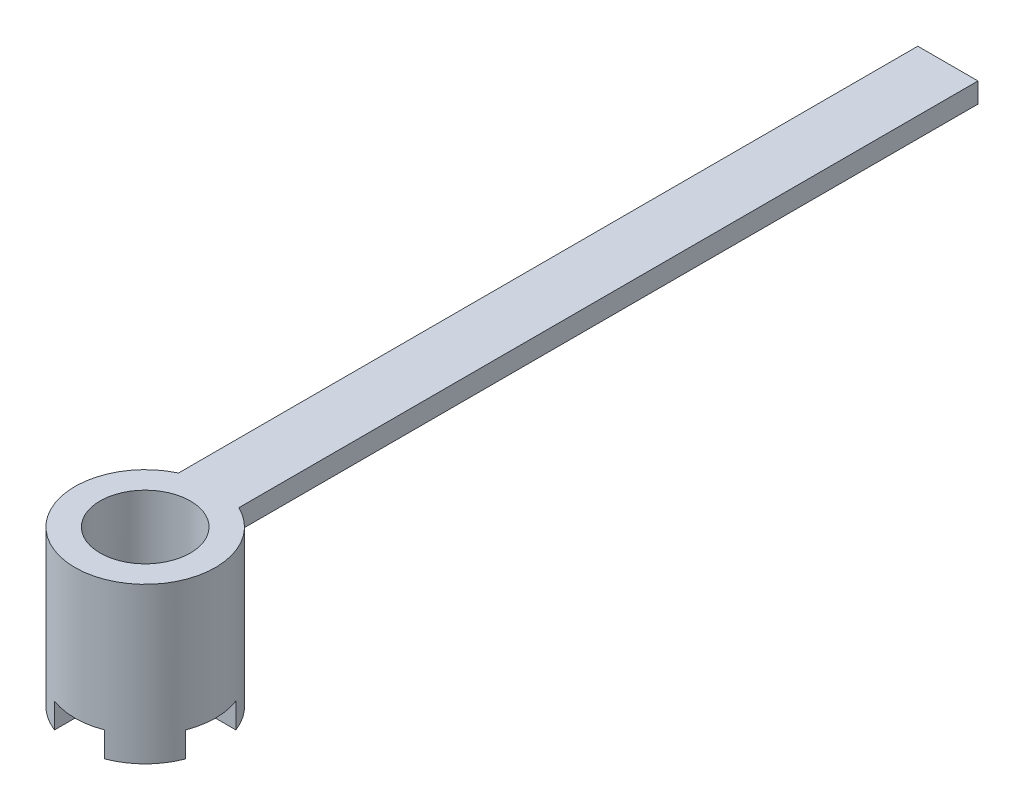
ISO-10303-21;
HEADER;
FILE_DESCRIPTION(('STEP AP214'),'2;1');
FILE_NAME('part.step','',(''),(''),'','','');
FILE_SCHEMA(('AUTOMOTIVE_DESIGN { 1 0 10303 214 1 1 1 1 }'));
ENDSEC;
DATA;
#1=APPLICATION_CONTEXT('core data for automotive mechanical design processes');
#2=APPLICATION_PROTOCOL_DEFINITION('international standard','automotive_design',2000,#1);
#3=PRODUCT_CONTEXT('',#1,'mechanical');
#4=PRODUCT('Part','Part','',(#3));
#5=PRODUCT_RELATED_PRODUCT_CATEGORY('part','',(#4));
#6=PRODUCT_DEFINITION_FORMATION('','',#4);
#7=PRODUCT_DEFINITION_CONTEXT('part definition',#1,'design');
#8=PRODUCT_DEFINITION('design','',#6,#7);
#9=PRODUCT_DEFINITION_SHAPE('','',#8);
#10=(LENGTH_UNIT() NAMED_UNIT(*) SI_UNIT(.MILLI.,.METRE.));
#11=(NAMED_UNIT(*) PLANE_ANGLE_UNIT() SI_UNIT($,.RADIAN.));
#12=(NAMED_UNIT(*) SI_UNIT($,.STERADIAN.) SOLID_ANGLE_UNIT());
#13=UNCERTAINTY_MEASURE_WITH_UNIT(LENGTH_MEASURE(1.E-05),#10,'distance_accuracy_value','');
#14=(GEOMETRIC_REPRESENTATION_CONTEXT(3) GLOBAL_UNCERTAINTY_ASSIGNED_CONTEXT((#13)) GLOBAL_UNIT_ASSIGNED_CONTEXT((#10,
#11,#12)) REPRESENTATION_CONTEXT('',''));
#15=CARTESIAN_POINT('',(0.,0.,0.));
#16=DIRECTION('',(0.,0.,1.));
#17=DIRECTION('',(1.,0.,0.));
#18=AXIS2_PLACEMENT_3D('',#15,#16,#17);
#19=CARTESIAN_POINT('',(0.,2.54,0.));
#20=DIRECTION('',(0.,-1.,0.));
#21=DIRECTION('',(0.,0.,-1.));
#22=AXIS2_PLACEMENT_3D('',#19,#20,#21);
#23=CYLINDRICAL_SURFACE('',#22,8.89);
#24=DIRECTION('',(0.,-1.,0.));
#25=VECTOR('',#24,1.);
#26=CARTESIAN_POINT('',(-3.81,2.54,-8.03218525682768));
#27=LINE('',#26,#25);
#28=CARTESIAN_POINT('',(-3.81,2.54,-8.03218525682768));
#29=VERTEX_POINT('',#28);
#30=CARTESIAN_POINT('',(-3.81,0.,-8.03218525682768));
#31=VERTEX_POINT('',#30);
#32=EDGE_CURVE('E44',#29,#31,#27,.T.);
#33=ORIENTED_EDGE('',*,*,#32,.T.);
#34=CARTESIAN_POINT('',(0.,0.,0.));
#35=DIRECTION('',(0.,-1.,0.));
#36=DIRECTION('',(0.,0.,-1.));
#37=AXIS2_PLACEMENT_3D('',#34,#35,#36);
#38=CIRCLE('',#37,8.89);
#39=CARTESIAN_POINT('',(3.81,0.,-8.03218525682768));
#40=VERTEX_POINT('',#39);
#41=EDGE_CURVE('E11',#31,#40,#38,.T.);
#42=ORIENTED_EDGE('',*,*,#41,.T.);
#43=DIRECTION('',(0.,-1.,0.));
#44=VECTOR('',#43,1.);
#45=CARTESIAN_POINT('',(3.81,2.54,-8.03218525682768));
#46=LINE('',#45,#44);
#47=CARTESIAN_POINT('',(3.81,2.54,-8.03218525682768));
#48=VERTEX_POINT('',#47);
#49=EDGE_CURVE('E318',#48,#40,#46,.T.);
#50=ORIENTED_EDGE('',*,*,#49,.F.);
#51=CARTESIAN_POINT('',(0.,2.54,0.));
#52=DIRECTION('',(0.,1.,0.));
#53=DIRECTION('',(0.,0.,1.));
#54=AXIS2_PLACEMENT_3D('',#51,#52,#53);
#55=CIRCLE('',#54,8.89);
#56=EDGE_CURVE('E304',#29,#48,#55,.T.);
#57=ORIENTED_EDGE('',*,*,#56,.F.);
#58=EDGE_LOOP('',(#33,#42,#50,#57));
#59=FACE_BOUND('',#58,.T.);
#60=DIRECTION('',(0.,-1.,0.));
#61=VECTOR('',#60,1.);
#62=CARTESIAN_POINT('',(3.175,-13.97,-8.30370248744498));
#63=LINE('',#62,#61);
#64=CARTESIAN_POINT('',(3.175,-13.97,-8.30370248744498));
#65=VERTEX_POINT('',#64);
#66=CARTESIAN_POINT('',(3.175,-17.145,-8.30370248744498));
#67=VERTEX_POINT('',#66);
#68=EDGE_CURVE('E201',#65,#67,#63,.T.);
#69=ORIENTED_EDGE('',*,*,#68,.F.);
#70=CARTESIAN_POINT('',(0.,-13.97,0.));
#71=DIRECTION('',(0.,-1.,0.));
#72=DIRECTION('',(0.,0.,-1.));
#73=AXIS2_PLACEMENT_3D('',#70,#71,#72);
#74=CIRCLE('',#73,8.89);
#75=CARTESIAN_POINT('',(-3.175,-13.97,-8.30370248744498));
#76=VERTEX_POINT('',#75);
#77=EDGE_CURVE('E182',#76,#65,#74,.T.);
#78=ORIENTED_EDGE('',*,*,#77,.F.);
#79=DIRECTION('',(0.,-1.,0.));
#80=VECTOR('',#79,1.);
#81=CARTESIAN_POINT('',(-3.175,-13.97,-8.30370248744498));
#82=LINE('',#81,#80);
#83=CARTESIAN_POINT('',(-3.175,-17.145,-8.30370248744498));
#84=VERTEX_POINT('',#83);
#85=EDGE_CURVE('E204',#76,#84,#82,.T.);
#86=ORIENTED_EDGE('',*,*,#85,.T.);
#87=CARTESIAN_POINT('',(0.,-17.145,0.));
#88=DIRECTION('',(0.,-1.,0.));
#89=DIRECTION('',(0.,0.,-1.));
#90=AXIS2_PLACEMENT_3D('',#87,#88,#89);
#91=CIRCLE('',#90,8.89);
#92=CARTESIAN_POINT('',(-8.30370248744498,-17.145,-3.175));
#93=VERTEX_POINT('',#92);
#94=EDGE_CURVE('E292',#93,#84,#91,.T.);
#95=ORIENTED_EDGE('',*,*,#94,.F.);
#96=DIRECTION('',(0.,-1.,0.));
#97=VECTOR('',#96,1.);
#98=CARTESIAN_POINT('',(-8.30370248744498,-13.97,-3.175));
#99=LINE('',#98,#97);
#100=CARTESIAN_POINT('',(-8.30370248744498,-13.97,-3.175));
#101=VERTEX_POINT('',#100);
#102=EDGE_CURVE('E274',#101,#93,#99,.T.);
#103=ORIENTED_EDGE('',*,*,#102,.F.);
#104=CARTESIAN_POINT('',(0.,-13.97,0.));
#105=DIRECTION('',(0.,-1.,0.));
#106=DIRECTION('',(0.,0.,-1.));
#107=AXIS2_PLACEMENT_3D('',#104,#105,#106);
#108=CIRCLE('',#107,8.89);
#109=CARTESIAN_POINT('',(-8.30370248744498,-13.97,3.175));
#110=VERTEX_POINT('',#109);
#111=EDGE_CURVE('E262',#110,#101,#108,.T.);
#112=ORIENTED_EDGE('',*,*,#111,.F.);
#113=DIRECTION('',(0.,-1.,0.));
#114=VECTOR('',#113,1.);
#115=CARTESIAN_POINT('',(-8.30370248744498,-13.97,3.175));
#116=LINE('',#115,#114);
#117=CARTESIAN_POINT('',(-8.30370248744498,-17.145,3.175));
#118=VERTEX_POINT('',#117);
#119=EDGE_CURVE('E278',#110,#118,#116,.T.);
#120=ORIENTED_EDGE('',*,*,#119,.T.);
#121=CARTESIAN_POINT('',(-3.175,-17.145,8.30370248744498));
#122=VERTEX_POINT('',#121);
#123=EDGE_CURVE('E291',#122,#118,#91,.T.);
#124=ORIENTED_EDGE('',*,*,#123,.F.);
#125=DIRECTION('',(0.,-1.,0.));
#126=VECTOR('',#125,1.);
#127=CARTESIAN_POINT('',(-3.175,-13.97,8.30370248744498));
#128=LINE('',#127,#126);
#129=CARTESIAN_POINT('',(-3.175,-13.97,8.30370248744498));
#130=VERTEX_POINT('',#129);
#131=EDGE_CURVE('E258',#130,#122,#128,.T.);
#132=ORIENTED_EDGE('',*,*,#131,.F.);
#133=CARTESIAN_POINT('',(0.,-13.97,0.));
#134=DIRECTION('',(0.,-1.,0.));
#135=DIRECTION('',(0.,0.,-1.));
#136=AXIS2_PLACEMENT_3D('',#133,#134,#135);
#137=CIRCLE('',#136,8.89);
#138=CARTESIAN_POINT('',(3.175,-13.97,8.30370248744498));
#139=VERTEX_POINT('',#138);
#140=EDGE_CURVE('E237',#139,#130,#137,.T.);
#141=ORIENTED_EDGE('',*,*,#140,.F.);
#142=DIRECTION('',(0.,-1.,0.));
#143=VECTOR('',#142,1.);
#144=CARTESIAN_POINT('',(3.175,-13.97,8.30370248744498));
#145=LINE('',#144,#143);
#146=CARTESIAN_POINT('',(3.175,-17.145,8.30370248744498));
#147=VERTEX_POINT('',#146);
#148=EDGE_CURVE('E247',#139,#147,#145,.T.);
#149=ORIENTED_EDGE('',*,*,#148,.T.);
#150=CARTESIAN_POINT('',(8.30370248744498,-17.145,3.175));
#151=VERTEX_POINT('',#150);
#152=EDGE_CURVE('E558',#151,#147,#91,.T.);
#153=ORIENTED_EDGE('',*,*,#152,.F.);
#154=DIRECTION('',(0.,-1.,0.));
#155=VECTOR('',#154,1.);
#156=CARTESIAN_POINT('',(8.30370248744498,-13.97,3.175));
#157=LINE('',#156,#155);
#158=CARTESIAN_POINT('',(8.30370248744498,-13.97,3.175));
#159=VERTEX_POINT('',#158);
#160=EDGE_CURVE('E229',#159,#151,#157,.T.);
#161=ORIENTED_EDGE('',*,*,#160,.F.);
#162=CARTESIAN_POINT('',(0.,-13.97,0.));
#163=DIRECTION('',(0.,-1.,0.));
#164=DIRECTION('',(0.,0.,-1.));
#165=AXIS2_PLACEMENT_3D('',#162,#163,#164);
#166=CIRCLE('',#165,8.89);
#167=CARTESIAN_POINT('',(8.30370248744498,-13.97,-3.175));
#168=VERTEX_POINT('',#167);
#169=EDGE_CURVE('E215',#168,#159,#166,.T.);
#170=ORIENTED_EDGE('',*,*,#169,.F.);
#171=DIRECTION('',(0.,-1.,0.));
#172=VECTOR('',#171,1.);
#173=CARTESIAN_POINT('',(8.30370248744498,-13.97,-3.175));
#174=LINE('',#173,#172);
#175=CARTESIAN_POINT('',(8.30370248744498,-17.145,-3.175));
#176=VERTEX_POINT('',#175);
#177=EDGE_CURVE('E231',#168,#176,#174,.T.);
#178=ORIENTED_EDGE('',*,*,#177,.T.);
#179=EDGE_CURVE('E296',#67,#176,#91,.T.);
#180=ORIENTED_EDGE('',*,*,#179,.F.);
#181=EDGE_LOOP('',(#69,#78,#86,#95,#103,#112,#120,#124,#132,#141,#149,#153,#161,#170,#178,#180));
#182=FACE_BOUND('',#181,.T.);
#183=ADVANCED_FACE('F35',(#59,#182),#23,.T.);
#184=CARTESIAN_POINT('',(0.,2.54,0.));
#185=DIRECTION('',(0.,-1.,0.));
#186=DIRECTION('',(0.,0.,-1.));
#187=AXIS2_PLACEMENT_3D('',#184,#185,#186);
#188=CYLINDRICAL_SURFACE('',#187,5.715);
#189=CARTESIAN_POINT('',(0.,2.54,0.));
#190=DIRECTION('',(0.,1.,0.));
#191=DIRECTION('',(0.,0.,1.));
#192=AXIS2_PLACEMENT_3D('',#189,#190,#191);
#193=CIRCLE('',#192,5.715);
#194=CARTESIAN_POINT('',(0.,2.54,5.715));
#195=VERTEX_POINT('',#194);
#196=EDGE_CURVE('E297',#195,#195,#193,.T.);
#197=ORIENTED_EDGE('',*,*,#196,.T.);
#198=EDGE_LOOP('',(#197));
#199=FACE_BOUND('',#198,.T.);
#200=CARTESIAN_POINT('',(0.,-13.97,0.));
#201=DIRECTION('',(0.,-1.,0.));
#202=DIRECTION('',(0.,0.,-1.));
#203=AXIS2_PLACEMENT_3D('',#200,#201,#202);
#204=CIRCLE('',#203,5.715);
#205=CARTESIAN_POINT('',(3.175,-13.97,-4.7519048812029));
#206=VERTEX_POINT('',#205);
#207=CARTESIAN_POINT('',(-3.175,-13.97,-4.7519048812029));
#208=VERTEX_POINT('',#207);
#209=EDGE_CURVE('E188',#206,#208,#204,.F.);
#210=ORIENTED_EDGE('',*,*,#209,.F.);
#211=DIRECTION('',(0.,-1.,0.));
#212=VECTOR('',#211,1.);
#213=CARTESIAN_POINT('',(3.175,-13.97,-4.7519048812029));
#214=LINE('',#213,#212);
#215=CARTESIAN_POINT('',(3.175,-17.145,-4.7519048812029));
#216=VERTEX_POINT('',#215);
#217=EDGE_CURVE('E174',#206,#216,#214,.T.);
#218=ORIENTED_EDGE('',*,*,#217,.T.);
#219=CARTESIAN_POINT('',(0.,-17.145,0.));
#220=DIRECTION('',(0.,-1.,0.));
#221=DIRECTION('',(0.,0.,-1.));
#222=AXIS2_PLACEMENT_3D('',#219,#220,#221);
#223=CIRCLE('',#222,5.715);
#224=CARTESIAN_POINT('',(4.7519048812029,-17.145,-3.175));
#225=VERTEX_POINT('',#224);
#226=EDGE_CURVE('E60',#216,#225,#223,.T.);
#227=ORIENTED_EDGE('',*,*,#226,.T.);
#228=DIRECTION('',(0.,-1.,0.));
#229=VECTOR('',#228,1.);
#230=CARTESIAN_POINT('',(4.7519048812029,-13.97,-3.175));
#231=LINE('',#230,#229);
#232=CARTESIAN_POINT('',(4.7519048812029,-13.97,-3.175));
#233=VERTEX_POINT('',#232);
#234=EDGE_CURVE('E220',#233,#225,#231,.T.);
#235=ORIENTED_EDGE('',*,*,#234,.F.);
#236=CARTESIAN_POINT('',(0.,-13.97,0.));
#237=DIRECTION('',(0.,-1.,0.));
#238=DIRECTION('',(0.,0.,-1.));
#239=AXIS2_PLACEMENT_3D('',#236,#237,#238);
#240=CIRCLE('',#239,5.715);
#241=CARTESIAN_POINT('',(4.7519048812029,-13.97,3.175));
#242=VERTEX_POINT('',#241);
#243=EDGE_CURVE('E208',#242,#233,#240,.F.);
#244=ORIENTED_EDGE('',*,*,#243,.F.);
#245=DIRECTION('',(0.,-1.,0.));
#246=VECTOR('',#245,1.);
#247=CARTESIAN_POINT('',(4.7519048812029,-13.97,3.175));
#248=LINE('',#247,#246);
#249=CARTESIAN_POINT('',(4.7519048812029,-17.145,3.175));
#250=VERTEX_POINT('',#249);
#251=EDGE_CURVE('E225',#242,#250,#248,.T.);
#252=ORIENTED_EDGE('',*,*,#251,.T.);
#253=CARTESIAN_POINT('',(3.175,-17.145,4.7519048812029));
#254=VERTEX_POINT('',#253);
#255=EDGE_CURVE('E549',#250,#254,#223,.T.);
#256=ORIENTED_EDGE('',*,*,#255,.T.);
#257=DIRECTION('',(0.,-1.,0.));
#258=VECTOR('',#257,1.);
#259=CARTESIAN_POINT('',(3.175,-13.97,4.7519048812029));
#260=LINE('',#259,#258);
#261=CARTESIAN_POINT('',(3.175,-13.97,4.7519048812029));
#262=VERTEX_POINT('',#261);
#263=EDGE_CURVE('E251',#262,#254,#260,.T.);
#264=ORIENTED_EDGE('',*,*,#263,.F.);
#265=CARTESIAN_POINT('',(0.,-13.97,0.));
#266=DIRECTION('',(0.,-1.,0.));
#267=DIRECTION('',(0.,0.,-1.));
#268=AXIS2_PLACEMENT_3D('',#265,#266,#267);
#269=CIRCLE('',#268,5.715);
#270=CARTESIAN_POINT('',(-3.175,-13.97,4.7519048812029));
#271=VERTEX_POINT('',#270);
#272=EDGE_CURVE('E244',#271,#262,#269,.F.);
#273=ORIENTED_EDGE('',*,*,#272,.F.);
#274=DIRECTION('',(0.,-1.,0.));
#275=VECTOR('',#274,1.);
#276=CARTESIAN_POINT('',(-3.175,-13.97,4.7519048812029));
#277=LINE('',#276,#275);
#278=CARTESIAN_POINT('',(-3.175,-17.145,4.7519048812029));
#279=VERTEX_POINT('',#278);
#280=EDGE_CURVE('E255',#271,#279,#277,.T.);
#281=ORIENTED_EDGE('',*,*,#280,.T.);
#282=CARTESIAN_POINT('',(-4.7519048812029,-17.145,3.175));
#283=VERTEX_POINT('',#282);
#284=EDGE_CURVE('E281',#279,#283,#223,.T.);
#285=ORIENTED_EDGE('',*,*,#284,.T.);
#286=DIRECTION('',(0.,-1.,0.));
#287=VECTOR('',#286,1.);
#288=CARTESIAN_POINT('',(-4.7519048812029,-13.97,3.175));
#289=LINE('',#288,#287);
#290=CARTESIAN_POINT('',(-4.7519048812029,-13.97,3.175));
#291=VERTEX_POINT('',#290);
#292=EDGE_CURVE('E282',#291,#283,#289,.T.);
#293=ORIENTED_EDGE('',*,*,#292,.F.);
#294=CARTESIAN_POINT('',(0.,-13.97,0.));
#295=DIRECTION('',(0.,-1.,0.));
#296=DIRECTION('',(0.,0.,-1.));
#297=AXIS2_PLACEMENT_3D('',#294,#295,#296);
#298=CIRCLE('',#297,5.715);
#299=CARTESIAN_POINT('',(-4.7519048812029,-13.97,-3.175));
#300=VERTEX_POINT('',#299);
#301=EDGE_CURVE('E269',#300,#291,#298,.F.);
#302=ORIENTED_EDGE('',*,*,#301,.F.);
#303=DIRECTION('',(0.,-1.,0.));
#304=VECTOR('',#303,1.);
#305=CARTESIAN_POINT('',(-4.7519048812029,-13.97,-3.175));
#306=LINE('',#305,#304);
#307=CARTESIAN_POINT('',(-4.7519048812029,-17.145,-3.175));
#308=VERTEX_POINT('',#307);
#309=EDGE_CURVE('E285',#300,#308,#306,.T.);
#310=ORIENTED_EDGE('',*,*,#309,.T.);
#311=CARTESIAN_POINT('',(-3.175,-17.145,-4.7519048812029));
#312=VERTEX_POINT('',#311);
#313=EDGE_CURVE('E289',#308,#312,#223,.T.);
#314=ORIENTED_EDGE('',*,*,#313,.T.);
#315=DIRECTION('',(0.,-1.,0.));
#316=VECTOR('',#315,1.);
#317=CARTESIAN_POINT('',(-3.175,-13.97,-4.7519048812029));
#318=LINE('',#317,#316);
#319=EDGE_CURVE('E52',#208,#312,#318,.T.);
#320=ORIENTED_EDGE('',*,*,#319,.F.);
#321=EDGE_LOOP('',(#210,#218,#227,#235,#244,#252,#256,#264,#273,#281,#285,#293,#302,#310,#314,#320));
#322=FACE_BOUND('',#321,.T.);
#323=ADVANCED_FACE('F37',(#199,#322),#188,.F.);
#324=CARTESIAN_POINT('',(0.,-17.145,0.));
#325=DIRECTION('',(0.,-1.,0.));
#326=DIRECTION('',(0.,0.,-1.));
#327=AXIS2_PLACEMENT_3D('',#324,#325,#326);
#328=PLANE('',#327);
#329=ORIENTED_EDGE('',*,*,#226,.F.);
#330=DIRECTION('',(0.,0.,-1.));
#331=VECTOR('',#330,1.);
#332=CARTESIAN_POINT('',(3.175,-17.145,0.));
#333=LINE('',#332,#331);
#334=EDGE_CURVE('E180',#216,#67,#333,.T.);
#335=ORIENTED_EDGE('',*,*,#334,.T.);
#336=ORIENTED_EDGE('',*,*,#179,.T.);
#337=DIRECTION('',(1.,0.,0.));
#338=VECTOR('',#337,1.);
#339=CARTESIAN_POINT('',(0.,-17.145,-3.175));
#340=LINE('',#339,#338);
#341=EDGE_CURVE('E203',#225,#176,#340,.T.);
#342=ORIENTED_EDGE('',*,*,#341,.F.);
#343=EDGE_LOOP('',(#329,#335,#336,#342));
#344=FACE_BOUND('',#343,.T.);
#345=ADVANCED_FACE('F368',(#344),#328,.T.);
#346=ORIENTED_EDGE('',*,*,#255,.F.);
#347=DIRECTION('',(1.,0.,0.));
#348=VECTOR('',#347,1.);
#349=CARTESIAN_POINT('',(0.,-17.145,3.175));
#350=LINE('',#349,#348);
#351=EDGE_CURVE('E212',#250,#151,#350,.T.);
#352=ORIENTED_EDGE('',*,*,#351,.T.);
#353=ORIENTED_EDGE('',*,*,#152,.T.);
#354=DIRECTION('',(0.,0.,-1.));
#355=VECTOR('',#354,1.);
#356=CARTESIAN_POINT('',(3.175,-17.145,0.));
#357=LINE('',#356,#355);
#358=EDGE_CURVE('E228',#147,#254,#357,.T.);
#359=ORIENTED_EDGE('',*,*,#358,.T.);
#360=EDGE_LOOP('',(#346,#352,#353,#359));
#361=FACE_BOUND('',#360,.T.);
#362=ADVANCED_FACE('F515',(#361),#328,.T.);
#363=DIRECTION('',(0.,0.,-1.));
#364=VECTOR('',#363,1.);
#365=CARTESIAN_POINT('',(-3.175,-17.145,0.));
#366=LINE('',#365,#364);
#367=EDGE_CURVE('E191',#312,#84,#366,.T.);
#368=ORIENTED_EDGE('',*,*,#367,.F.);
#369=ORIENTED_EDGE('',*,*,#313,.F.);
#370=DIRECTION('',(1.,0.,0.));
#371=VECTOR('',#370,1.);
#372=CARTESIAN_POINT('',(0.,-17.145,-3.175));
#373=LINE('',#372,#371);
#374=EDGE_CURVE('E254',#93,#308,#373,.T.);
#375=ORIENTED_EDGE('',*,*,#374,.F.);
#376=ORIENTED_EDGE('',*,*,#94,.T.);
#377=EDGE_LOOP('',(#368,#369,#375,#376));
#378=FACE_BOUND('',#377,.T.);
#379=ADVANCED_FACE('F378',(#378),#328,.T.);
#380=DIRECTION('',(0.,0.,-1.));
#381=VECTOR('',#380,1.);
#382=CARTESIAN_POINT('',(-3.175,-17.145,0.));
#383=LINE('',#382,#381);
#384=EDGE_CURVE('E238',#122,#279,#383,.T.);
#385=ORIENTED_EDGE('',*,*,#384,.F.);
#386=ORIENTED_EDGE('',*,*,#123,.T.);
#387=DIRECTION('',(1.,0.,0.));
#388=VECTOR('',#387,1.);
#389=CARTESIAN_POINT('',(0.,-17.145,3.175));
#390=LINE('',#389,#388);
#391=EDGE_CURVE('E266',#118,#283,#390,.T.);
#392=ORIENTED_EDGE('',*,*,#391,.T.);
#393=ORIENTED_EDGE('',*,*,#284,.F.);
#394=EDGE_LOOP('',(#385,#386,#392,#393));
#395=FACE_BOUND('',#394,.T.);
#396=ADVANCED_FACE('F374',(#395),#328,.T.);
#397=CARTESIAN_POINT('',(0.,0.,0.));
#398=DIRECTION('',(0.,1.,0.));
#399=DIRECTION('',(0.,0.,1.));
#400=AXIS2_PLACEMENT_3D('',#397,#398,#399);
#401=PLANE('',#400);
#402=ORIENTED_EDGE('',*,*,#41,.F.);
#403=DIRECTION('',(0.,0.,1.));
#404=VECTOR('',#403,1.);
#405=CARTESIAN_POINT('',(-3.81,0.,0.));
#406=LINE('',#405,#404);
#407=CARTESIAN_POINT('',(-3.81000000000002,0.,-101.6));
#408=VERTEX_POINT('',#407);
#409=EDGE_CURVE('E295',#408,#31,#406,.T.);
#410=ORIENTED_EDGE('',*,*,#409,.F.);
#411=DIRECTION('',(-1.,0.,0.));
#412=VECTOR('',#411,1.);
#413=CARTESIAN_POINT('',(0.,0.,-101.6));
#414=LINE('',#413,#412);
#415=CARTESIAN_POINT('',(3.80999999999996,0.,-101.6));
#416=VERTEX_POINT('',#415);
#417=EDGE_CURVE('E301',#416,#408,#414,.T.);
#418=ORIENTED_EDGE('',*,*,#417,.F.);
#419=DIRECTION('',(0.,0.,1.));
#420=VECTOR('',#419,1.);
#421=CARTESIAN_POINT('',(3.81,0.,0.));
#422=LINE('',#421,#420);
#423=EDGE_CURVE('E313',#416,#40,#422,.T.);
#424=ORIENTED_EDGE('',*,*,#423,.T.);
#425=EDGE_LOOP('',(#402,#410,#418,#424));
#426=FACE_BOUND('',#425,.T.);
#427=ADVANCED_FACE('F337',(#426),#401,.F.);
#428=CARTESIAN_POINT('',(-3.81,2.54,0.));
#429=DIRECTION('',(1.,0.,0.));
#430=DIRECTION('',(0.,0.,-1.));
#431=AXIS2_PLACEMENT_3D('',#428,#429,#430);
#432=PLANE('',#431);
#433=ORIENTED_EDGE('',*,*,#409,.T.);
#434=ORIENTED_EDGE('',*,*,#32,.F.);
#435=DIRECTION('',(0.,0.,1.));
#436=VECTOR('',#435,1.);
#437=CARTESIAN_POINT('',(-3.81,2.54,0.));
#438=LINE('',#437,#436);
#439=CARTESIAN_POINT('',(-3.81000000000002,2.54,-101.6));
#440=VERTEX_POINT('',#439);
#441=EDGE_CURVE('E300',#440,#29,#438,.T.);
#442=ORIENTED_EDGE('',*,*,#441,.F.);
#443=DIRECTION('',(0.,-1.,0.));
#444=VECTOR('',#443,1.);
#445=CARTESIAN_POINT('',(-3.81000000000002,2.54,-101.6));
#446=LINE('',#445,#444);
#447=EDGE_CURVE('E311',#440,#408,#446,.T.);
#448=ORIENTED_EDGE('',*,*,#447,.T.);
#449=EDGE_LOOP('',(#433,#434,#442,#448));
#450=FACE_BOUND('',#449,.T.);
#451=ADVANCED_FACE('F345',(#450),#432,.F.);
#452=CARTESIAN_POINT('',(3.81,2.54,0.));
#453=DIRECTION('',(1.,0.,0.));
#454=DIRECTION('',(0.,0.,-1.));
#455=AXIS2_PLACEMENT_3D('',#452,#453,#454);
#456=PLANE('',#455);
#457=ORIENTED_EDGE('',*,*,#423,.F.);
#458=DIRECTION('',(0.,-1.,0.));
#459=VECTOR('',#458,1.);
#460=CARTESIAN_POINT('',(3.80999999999996,2.54,-101.6));
#461=LINE('',#460,#459);
#462=CARTESIAN_POINT('',(3.80999999999996,2.54,-101.6));
#463=VERTEX_POINT('',#462);
#464=EDGE_CURVE('E316',#463,#416,#461,.T.);
#465=ORIENTED_EDGE('',*,*,#464,.F.);
#466=DIRECTION('',(0.,0.,1.));
#467=VECTOR('',#466,1.);
#468=CARTESIAN_POINT('',(3.81,2.54,0.));
#469=LINE('',#468,#467);
#470=EDGE_CURVE('E306',#463,#48,#469,.T.);
#471=ORIENTED_EDGE('',*,*,#470,.T.);
#472=ORIENTED_EDGE('',*,*,#49,.T.);
#473=EDGE_LOOP('',(#457,#465,#471,#472));
#474=FACE_BOUND('',#473,.T.);
#475=ADVANCED_FACE('F340',(#474),#456,.T.);
#476=CARTESIAN_POINT('',(0.,2.54,-101.6));
#477=DIRECTION('',(0.,0.,1.));
#478=DIRECTION('',(1.,0.,0.));
#479=AXIS2_PLACEMENT_3D('',#476,#477,#478);
#480=PLANE('',#479);
#481=ORIENTED_EDGE('',*,*,#417,.T.);
#482=ORIENTED_EDGE('',*,*,#447,.F.);
#483=DIRECTION('',(-1.,0.,0.));
#484=VECTOR('',#483,1.);
#485=CARTESIAN_POINT('',(0.,2.54,-101.6));
#486=LINE('',#485,#484);
#487=EDGE_CURVE('E309',#463,#440,#486,.T.);
#488=ORIENTED_EDGE('',*,*,#487,.F.);
#489=ORIENTED_EDGE('',*,*,#464,.T.);
#490=EDGE_LOOP('',(#481,#482,#488,#489));
#491=FACE_BOUND('',#490,.T.);
#492=ADVANCED_FACE('F351',(#491),#480,.F.);
#493=CARTESIAN_POINT('',(0.,2.54,0.));
#494=DIRECTION('',(0.,1.,0.));
#495=DIRECTION('',(0.,0.,1.));
#496=AXIS2_PLACEMENT_3D('',#493,#494,#495);
#497=PLANE('',#496);
#498=ORIENTED_EDGE('',*,*,#196,.F.);
#499=EDGE_LOOP('',(#498));
#500=FACE_BOUND('',#499,.T.);
#501=ORIENTED_EDGE('',*,*,#441,.T.);
#502=ORIENTED_EDGE('',*,*,#56,.T.);
#503=ORIENTED_EDGE('',*,*,#470,.F.);
#504=ORIENTED_EDGE('',*,*,#487,.T.);
#505=EDGE_LOOP('',(#501,#502,#503,#504));
#506=FACE_BOUND('',#505,.T.);
#507=ADVANCED_FACE('F348',(#500,#506),#497,.T.);
#508=CARTESIAN_POINT('',(0.,-13.97,3.175));
#509=DIRECTION('',(0.,0.,-1.));
#510=DIRECTION('',(-1.,0.,0.));
#511=AXIS2_PLACEMENT_3D('',#508,#509,#510);
#512=PLANE('',#511);
#513=ORIENTED_EDGE('',*,*,#391,.F.);
#514=ORIENTED_EDGE('',*,*,#119,.F.);
#515=DIRECTION('',(1.,0.,0.));
#516=VECTOR('',#515,1.);
#517=CARTESIAN_POINT('',(0.,-13.97,3.175));
#518=LINE('',#517,#516);
#519=EDGE_CURVE('E272',#110,#291,#518,.T.);
#520=ORIENTED_EDGE('',*,*,#519,.T.);
#521=ORIENTED_EDGE('',*,*,#292,.T.);
#522=EDGE_LOOP('',(#513,#514,#520,#521));
#523=FACE_BOUND('',#522,.T.);
#524=ADVANCED_FACE('F358',(#523),#512,.T.);
#525=CARTESIAN_POINT('',(0.,-13.97,-3.175));
#526=DIRECTION('',(0.,0.,-1.));
#527=DIRECTION('',(-1.,0.,0.));
#528=AXIS2_PLACEMENT_3D('',#525,#526,#527);
#529=PLANE('',#528);
#530=ORIENTED_EDGE('',*,*,#374,.T.);
#531=ORIENTED_EDGE('',*,*,#309,.F.);
#532=DIRECTION('',(1.,0.,0.));
#533=VECTOR('',#532,1.);
#534=CARTESIAN_POINT('',(0.,-13.97,-3.175));
#535=LINE('',#534,#533);
#536=EDGE_CURVE('E265',#101,#300,#535,.T.);
#537=ORIENTED_EDGE('',*,*,#536,.F.);
#538=ORIENTED_EDGE('',*,*,#102,.T.);
#539=EDGE_LOOP('',(#530,#531,#537,#538));
#540=FACE_BOUND('',#539,.T.);
#541=ADVANCED_FACE('F382',(#540),#529,.F.);
#542=CARTESIAN_POINT('',(0.,-13.97,0.));
#543=DIRECTION('',(0.,-1.,0.));
#544=DIRECTION('',(0.,0.,-1.));
#545=AXIS2_PLACEMENT_3D('',#542,#543,#544);
#546=PLANE('',#545);
#547=ORIENTED_EDGE('',*,*,#111,.T.);
#548=ORIENTED_EDGE('',*,*,#536,.T.);
#549=ORIENTED_EDGE('',*,*,#301,.T.);
#550=ORIENTED_EDGE('',*,*,#519,.F.);
#551=EDGE_LOOP('',(#547,#548,#549,#550));
#552=FACE_BOUND('',#551,.T.);
#553=ADVANCED_FACE('F385',(#552),#546,.T.);
#554=CARTESIAN_POINT('',(3.175,-13.97,0.));
#555=DIRECTION('',(-1.,0.,0.));
#556=DIRECTION('',(0.,0.,1.));
#557=AXIS2_PLACEMENT_3D('',#554,#555,#556);
#558=PLANE('',#557);
#559=ORIENTED_EDGE('',*,*,#358,.F.);
#560=ORIENTED_EDGE('',*,*,#148,.F.);
#561=DIRECTION('',(0.,0.,-1.));
#562=VECTOR('',#561,1.);
#563=CARTESIAN_POINT('',(3.175,-13.97,0.));
#564=LINE('',#563,#562);
#565=EDGE_CURVE('E235',#139,#262,#564,.T.);
#566=ORIENTED_EDGE('',*,*,#565,.T.);
#567=ORIENTED_EDGE('',*,*,#263,.T.);
#568=EDGE_LOOP('',(#559,#560,#566,#567));
#569=FACE_BOUND('',#568,.T.);
#570=ADVANCED_FACE('F392',(#569),#558,.T.);
#571=CARTESIAN_POINT('',(-3.175,-13.97,0.));
#572=DIRECTION('',(-1.,0.,0.));
#573=DIRECTION('',(0.,0.,1.));
#574=AXIS2_PLACEMENT_3D('',#571,#572,#573);
#575=PLANE('',#574);
#576=ORIENTED_EDGE('',*,*,#384,.T.);
#577=ORIENTED_EDGE('',*,*,#280,.F.);
#578=DIRECTION('',(0.,0.,-1.));
#579=VECTOR('',#578,1.);
#580=CARTESIAN_POINT('',(-3.175,-13.97,0.));
#581=LINE('',#580,#579);
#582=EDGE_CURVE('E241',#130,#271,#581,.T.);
#583=ORIENTED_EDGE('',*,*,#582,.F.);
#584=ORIENTED_EDGE('',*,*,#131,.T.);
#585=EDGE_LOOP('',(#576,#577,#583,#584));
#586=FACE_BOUND('',#585,.T.);
#587=ADVANCED_FACE('F396',(#586),#575,.F.);
#588=CARTESIAN_POINT('',(0.,-13.97,0.));
#589=DIRECTION('',(0.,-1.,0.));
#590=DIRECTION('',(0.,0.,-1.));
#591=AXIS2_PLACEMENT_3D('',#588,#589,#590);
#592=PLANE('',#591);
#593=ORIENTED_EDGE('',*,*,#565,.F.);
#594=ORIENTED_EDGE('',*,*,#140,.T.);
#595=ORIENTED_EDGE('',*,*,#582,.T.);
#596=ORIENTED_EDGE('',*,*,#272,.T.);
#597=EDGE_LOOP('',(#593,#594,#595,#596));
#598=FACE_BOUND('',#597,.T.);
#599=ADVANCED_FACE('F400',(#598),#592,.T.);
#600=CARTESIAN_POINT('',(0.,-13.97,3.175));
#601=DIRECTION('',(0.,0.,-1.));
#602=DIRECTION('',(-1.,0.,0.));
#603=AXIS2_PLACEMENT_3D('',#600,#601,#602);
#604=PLANE('',#603);
#605=ORIENTED_EDGE('',*,*,#351,.F.);
#606=ORIENTED_EDGE('',*,*,#251,.F.);
#607=DIRECTION('',(1.,0.,0.));
#608=VECTOR('',#607,1.);
#609=CARTESIAN_POINT('',(0.,-13.97,3.175));
#610=LINE('',#609,#608);
#611=EDGE_CURVE('E218',#242,#159,#610,.T.);
#612=ORIENTED_EDGE('',*,*,#611,.T.);
#613=ORIENTED_EDGE('',*,*,#160,.T.);
#614=EDGE_LOOP('',(#605,#606,#612,#613));
#615=FACE_BOUND('',#614,.T.);
#616=ADVANCED_FACE('F404',(#615),#604,.T.);
#617=CARTESIAN_POINT('',(0.,-13.97,-3.175));
#618=DIRECTION('',(0.,0.,-1.));
#619=DIRECTION('',(-1.,0.,0.));
#620=AXIS2_PLACEMENT_3D('',#617,#618,#619);
#621=PLANE('',#620);
#622=ORIENTED_EDGE('',*,*,#341,.T.);
#623=ORIENTED_EDGE('',*,*,#177,.F.);
#624=DIRECTION('',(1.,0.,0.));
#625=VECTOR('',#624,1.);
#626=CARTESIAN_POINT('',(0.,-13.97,-3.175));
#627=LINE('',#626,#625);
#628=EDGE_CURVE('E211',#233,#168,#627,.T.);
#629=ORIENTED_EDGE('',*,*,#628,.F.);
#630=ORIENTED_EDGE('',*,*,#234,.T.);
#631=EDGE_LOOP('',(#622,#623,#629,#630));
#632=FACE_BOUND('',#631,.T.);
#633=ADVANCED_FACE('F406',(#632),#621,.F.);
#634=CARTESIAN_POINT('',(0.,-13.97,0.));
#635=DIRECTION('',(0.,-1.,0.));
#636=DIRECTION('',(0.,0.,-1.));
#637=AXIS2_PLACEMENT_3D('',#634,#635,#636);
#638=PLANE('',#637);
#639=ORIENTED_EDGE('',*,*,#243,.T.);
#640=ORIENTED_EDGE('',*,*,#628,.T.);
#641=ORIENTED_EDGE('',*,*,#169,.T.);
#642=ORIENTED_EDGE('',*,*,#611,.F.);
#643=EDGE_LOOP('',(#639,#640,#641,#642));
#644=FACE_BOUND('',#643,.T.);
#645=ADVANCED_FACE('F409',(#644),#638,.T.);
#646=CARTESIAN_POINT('',(3.175,-13.97,0.));
#647=DIRECTION('',(-1.,0.,0.));
#648=DIRECTION('',(0.,0.,1.));
#649=AXIS2_PLACEMENT_3D('',#646,#647,#648);
#650=PLANE('',#649);
#651=ORIENTED_EDGE('',*,*,#334,.F.);
#652=ORIENTED_EDGE('',*,*,#217,.F.);
#653=DIRECTION('',(0.,0.,-1.));
#654=VECTOR('',#653,1.);
#655=CARTESIAN_POINT('',(3.175,-13.97,0.));
#656=LINE('',#655,#654);
#657=EDGE_CURVE('E177',#206,#65,#656,.T.);
#658=ORIENTED_EDGE('',*,*,#657,.T.);
#659=ORIENTED_EDGE('',*,*,#68,.T.);
#660=EDGE_LOOP('',(#651,#652,#658,#659));
#661=FACE_BOUND('',#660,.T.);
#662=ADVANCED_FACE('F176',(#661),#650,.T.);
#663=CARTESIAN_POINT('',(-3.175,-13.97,0.));
#664=DIRECTION('',(-1.,0.,0.));
#665=DIRECTION('',(0.,0.,1.));
#666=AXIS2_PLACEMENT_3D('',#663,#664,#665);
#667=PLANE('',#666);
#668=ORIENTED_EDGE('',*,*,#367,.T.);
#669=ORIENTED_EDGE('',*,*,#85,.F.);
#670=DIRECTION('',(0.,0.,-1.));
#671=VECTOR('',#670,1.);
#672=CARTESIAN_POINT('',(-3.175,-13.97,0.));
#673=LINE('',#672,#671);
#674=EDGE_CURVE('E194',#208,#76,#673,.T.);
#675=ORIENTED_EDGE('',*,*,#674,.F.);
#676=ORIENTED_EDGE('',*,*,#319,.T.);
#677=EDGE_LOOP('',(#668,#669,#675,#676));
#678=FACE_BOUND('',#677,.T.);
#679=ADVANCED_FACE('F419',(#678),#667,.F.);
#680=CARTESIAN_POINT('',(0.,-13.97,0.));
#681=DIRECTION('',(0.,-1.,0.));
#682=DIRECTION('',(0.,0.,-1.));
#683=AXIS2_PLACEMENT_3D('',#680,#681,#682);
#684=PLANE('',#683);
#685=ORIENTED_EDGE('',*,*,#657,.F.);
#686=ORIENTED_EDGE('',*,*,#209,.T.);
#687=ORIENTED_EDGE('',*,*,#674,.T.);
#688=ORIENTED_EDGE('',*,*,#77,.T.);
#689=EDGE_LOOP('',(#685,#686,#687,#688));
#690=FACE_BOUND('',#689,.T.);
#691=ADVANCED_FACE('F186',(#690),#684,.T.);
#692=CLOSED_SHELL('',(#183,#323,#345,#362,#379,#396,#427,#451,#475,#492,#507,#524,#541,#553,
#570,#587,#599,#616,#633,#645,#662,#679,#691));
#693=MANIFOLD_SOLID_BREP('B2',#692);
#694=ADVANCED_BREP_SHAPE_REPRESENTATION('',(#18,#693),#14);
#695=SHAPE_DEFINITION_REPRESENTATION(#9,#694);
ENDSEC;
END-ISO-10303-21;
